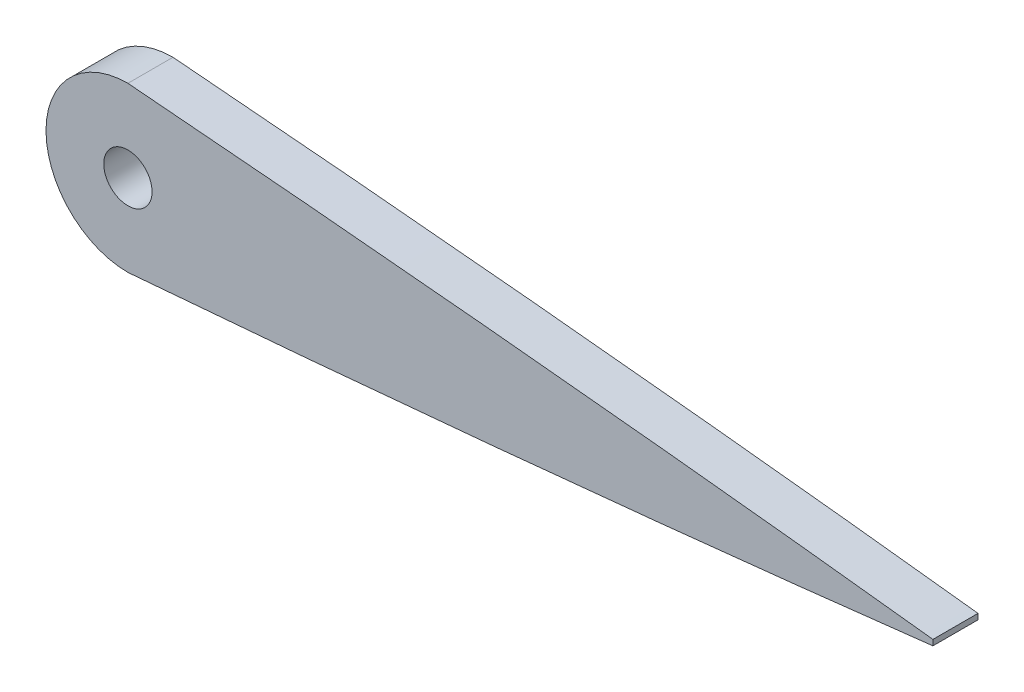
ISO-10303-21;
HEADER;
FILE_DESCRIPTION(('STEP AP214'),'2;1');
FILE_NAME('part.step','',(''),(''),'','','');
FILE_SCHEMA(('AUTOMOTIVE_DESIGN { 1 0 10303 214 1 1 1 1 }'));
ENDSEC;
DATA;
#1=APPLICATION_CONTEXT('core data for automotive mechanical design processes');
#2=APPLICATION_PROTOCOL_DEFINITION('international standard','automotive_design',2000,#1);
#3=PRODUCT_CONTEXT('',#1,'mechanical');
#4=PRODUCT('Part','Part','',(#3));
#5=PRODUCT_RELATED_PRODUCT_CATEGORY('part','',(#4));
#6=PRODUCT_DEFINITION_FORMATION('','',#4);
#7=PRODUCT_DEFINITION_CONTEXT('part definition',#1,'design');
#8=PRODUCT_DEFINITION('design','',#6,#7);
#9=PRODUCT_DEFINITION_SHAPE('','',#8);
#10=(LENGTH_UNIT() NAMED_UNIT(*) SI_UNIT(.MILLI.,.METRE.));
#11=(NAMED_UNIT(*) PLANE_ANGLE_UNIT() SI_UNIT($,.RADIAN.));
#12=(NAMED_UNIT(*) SI_UNIT($,.STERADIAN.) SOLID_ANGLE_UNIT());
#13=UNCERTAINTY_MEASURE_WITH_UNIT(LENGTH_MEASURE(1.E-05),#10,'distance_accuracy_value','');
#14=(GEOMETRIC_REPRESENTATION_CONTEXT(3) GLOBAL_UNCERTAINTY_ASSIGNED_CONTEXT((#13)) GLOBAL_UNIT_ASSIGNED_CONTEXT((#10,
#11,#12)) REPRESENTATION_CONTEXT('',''));
#15=CARTESIAN_POINT('',(0.,0.,0.));
#16=DIRECTION('',(0.,0.,1.));
#17=DIRECTION('',(1.,0.,0.));
#18=AXIS2_PLACEMENT_3D('',#15,#16,#17);
#19=CARTESIAN_POINT('',(150.000001319017,0.,1.4));
#20=DIRECTION('',(0.,0.,-1.));
#21=DIRECTION('',(-1.,0.,0.));
#22=AXIS2_PLACEMENT_3D('',#19,#20,#21);
#23=CYLINDRICAL_SURFACE('',#22,5.08710089871163);
#24=CARTESIAN_POINT('',(150.000001319017,0.,-1.4));
#25=DIRECTION('',(0.,0.,1.));
#26=DIRECTION('',(1.,0.,0.));
#27=AXIS2_PLACEMENT_3D('',#24,#25,#26);
#28=CIRCLE('',#27,5.08710089871163);
#29=CARTESIAN_POINT('',(150.,5.08710089871146,-1.4));
#30=VERTEX_POINT('',#29);
#31=CARTESIAN_POINT('',(150.,-5.08710089871146,-1.4));
#32=VERTEX_POINT('',#31);
#33=EDGE_CURVE('E136',#30,#32,#28,.T.);
#34=ORIENTED_EDGE('',*,*,#33,.T.);
#35=DIRECTION('',(0.,0.,-1.));
#36=VECTOR('',#35,1.);
#37=CARTESIAN_POINT('',(150.,-5.08710089871146,1.4));
#38=LINE('',#37,#36);
#39=CARTESIAN_POINT('',(150.,-5.08710089871146,1.4));
#40=VERTEX_POINT('',#39);
#41=EDGE_CURVE('E11',#40,#32,#38,.T.);
#42=ORIENTED_EDGE('',*,*,#41,.F.);
#43=CARTESIAN_POINT('',(150.000001319017,0.,1.4));
#44=DIRECTION('',(0.,0.,1.));
#45=DIRECTION('',(1.,0.,0.));
#46=AXIS2_PLACEMENT_3D('',#43,#44,#45);
#47=CIRCLE('',#46,5.08710089871163);
#48=CARTESIAN_POINT('',(150.,5.08710089871146,1.4));
#49=VERTEX_POINT('',#48);
#50=EDGE_CURVE('E90',#49,#40,#47,.T.);
#51=ORIENTED_EDGE('',*,*,#50,.F.);
#52=DIRECTION('',(0.,0.,-1.));
#53=VECTOR('',#52,1.);
#54=CARTESIAN_POINT('',(150.,5.08710089871146,1.4));
#55=LINE('',#54,#53);
#56=EDGE_CURVE('E105',#49,#30,#55,.T.);
#57=ORIENTED_EDGE('',*,*,#56,.T.);
#58=EDGE_LOOP('',(#34,#42,#51,#57));
#59=FACE_BOUND('',#58,.T.);
#60=ADVANCED_FACE('F41',(#59),#23,.T.);
#61=CARTESIAN_POINT('',(33.6,0.,1.4));
#62=CARTESIAN_POINT('',(33.6269941674373,-0.231708515527983,1.4));
#63=CARTESIAN_POINT('',(33.6837268204217,-0.71868181579728,1.4));
#64=CARTESIAN_POINT('',(34.1189953762262,-1.39684945733152,1.4));
#65=CARTESIAN_POINT('',(34.7710021592154,-2.03453876927053,1.4));
#66=CARTESIAN_POINT('',(35.6651570451169,-2.64410225227602,1.4));
#67=CARTESIAN_POINT('',(36.7878210833191,-3.22944151280152,1.4));
#68=CARTESIAN_POINT('',(38.1397245257122,-3.79104271473269,1.4));
#69=CARTESIAN_POINT('',(39.7153622867981,-4.3277629002946,1.4));
#70=CARTESIAN_POINT('',(41.5101784639862,-4.8379015027305,1.4));
#71=CARTESIAN_POINT('',(43.5185258591893,-5.31970764728648,1.4));
#72=CARTESIAN_POINT('',(45.7346309012544,-5.77126154267694,1.4));
#73=CARTESIAN_POINT('',(48.1524100311102,-6.19073197222748,1.4));
#74=CARTESIAN_POINT('',(50.7655901479076,-6.57637303978282,1.4));
#75=CARTESIAN_POINT('',(53.5677275795446,-6.92657061910981,1.4));
#76=CARTESIAN_POINT('',(56.5522008575467,-7.23984921539396,1.4));
#77=CARTESIAN_POINT('',(59.7122117540152,-7.51501997525792,1.4));
#78=CARTESIAN_POINT('',(63.0408031036648,-7.75098927114006,1.4));
#79=CARTESIAN_POINT('',(66.5308206591967,-7.94704431423214,1.4));
#80=CARTESIAN_POINT('',(70.1749391772892,-8.10268745028156,1.4));
#81=CARTESIAN_POINT('',(73.9656231927854,-8.21771888836872,1.4));
#82=CARTESIAN_POINT('',(77.8951316198913,-8.29213172726254,1.4));
#83=CARTESIAN_POINT('',(81.9554909551757,-8.32638483385091,1.4));
#84=CARTESIAN_POINT('',(86.1384972727807,-8.32098146620866,1.4));
#85=CARTESIAN_POINT('',(90.4356778928133,-8.27688640845994,1.4));
#86=CARTESIAN_POINT('',(94.8382835601136,-8.19518684837898,1.4));
#87=CARTESIAN_POINT('',(99.3372533058883,-8.07721034364158,1.4));
#88=CARTESIAN_POINT('',(103.923211277285,-7.92451466510414,1.4));
#89=CARTESIAN_POINT('',(108.586398201898,-7.73879249394249,1.4));
#90=CARTESIAN_POINT('',(113.316671903632,-7.5218716385051,1.4));
#91=CARTESIAN_POINT('',(118.103435227251,-7.27569840059715,1.4));
#92=CARTESIAN_POINT('',(122.935626986936,-7.00233408107662,1.4));
#93=CARTESIAN_POINT('',(127.801626971568,-6.70383804581322,1.4));
#94=CARTESIAN_POINT('',(132.689220420298,-6.38239371078741,1.4));
#95=CARTESIAN_POINT('',(137.585492164653,-6.04018744674526,1.4));
#96=CARTESIAN_POINT('',(142.476750858107,-5.67937341836179,1.4));
#97=CARTESIAN_POINT('',(147.348408074387,-5.30224620375692,1.4));
#98=CARTESIAN_POINT('',(152.184839901118,-4.91110131824046,1.4));
#99=CARTESIAN_POINT('',(156.969182150947,-4.50827690949581,1.4));
#100=CARTESIAN_POINT('',(161.68314962687,-4.09629096759658,1.4));
#101=CARTESIAN_POINT('',(166.30668258492,-3.67780398045322,1.4));
#102=CARTESIAN_POINT('',(170.817585440789,-3.25579759485396,1.4));
#103=CARTESIAN_POINT('',(175.190940480879,-2.83354037712416,1.4));
#104=CARTESIAN_POINT('',(179.398353356594,-2.41494180210841,1.4));
#105=CARTESIAN_POINT('',(183.406732335512,-2.00449023066667,1.4));
#106=CARTESIAN_POINT('',(187.176422044898,-1.60782267291746,1.4));
#107=CARTESIAN_POINT('',(190.657944971499,-1.23193839552261,1.4));
#108=CARTESIAN_POINT('',(193.785612886082,-0.886133118139137,1.4));
#109=CARTESIAN_POINT('',(196.461970705466,-0.583806064397546,1.4));
#110=CARTESIAN_POINT('',(198.485364747044,-0.351356883647495,1.4));
#111=CARTESIAN_POINT('',(199.600682764795,-0.221288407724341,1.4));
#112=CARTESIAN_POINT('',(200.,-0.17472,1.4));
#113=B_SPLINE_CURVE_WITH_KNOTS('',3,(#61,#62,#63,#64,#65,#66,#67,#68,#69,#70,#71,#72,#73,#74,
#75,#76,#77,#78,#79,#80,#81,#82,#83,#84,#85,#86,#87,#88,#89,#90,#91,#92,#93,#94,#95,#96,#97,#98,
#99,#100,#101,#102,#103,#104,#105,#106,#107,#108,#109,#110,#111,#112),.UNSPECIFIED.,.F.,.F.,(4,
1,1,1,1,1,1,1,1,1,1,1,1,1,1,1,1,1,1,1,1,1,1,1,1,1,1,1,1,1,1,1,1,1,1,1,1,1,1,1,1,1,1,1,1,1,1,1,1,
4),(0.,0.00409901119627092,0.00861474169622299,0.0139348547249599,0.0202777746115652,
0.0277529807018321,0.0364102145151941,0.0462664329749787,0.0573202378372115,0.0695589461393584,
0.0829628608595733,0.0975072182865601,0.113164081930901,0.129902689855962,0.147690303906225,
0.166492184642377,0.186271967143037,0.20699186142487,0.228612214931191,0.251092164926075,
0.274388983443392,0.298458209116106,0.323253842050904,0.348727970896185,0.374830386774742,
0.40150919043188,0.428710015435301,0.456376153357357,0.484448082626422,0.512863886494765,
0.541558094079265,0.570462312972837,0.599504247337292,0.628607348866529,0.657690446286488,
0.686667237400073,0.715444849047863,0.743923546243729,0.771994829693491,0.79954025298555,
0.826428322167508,0.852512114464386,0.877624445997854,0.901571133904931,0.924121062375889,
0.944988816472436,0.963803939012756,0.980044339265493,0.992855276123615,1.),.UNSPECIFIED.);
#114=DIRECTION('',(0.,0.,-1.));
#115=VECTOR('',#114,1.);
#116=SURFACE_OF_LINEAR_EXTRUSION('',#113,#115);
#117=CARTESIAN_POINT('',(33.6,0.,-1.4));
#118=CARTESIAN_POINT('',(33.6269941674373,-0.231708515527983,-1.4));
#119=CARTESIAN_POINT('',(33.6837268204217,-0.71868181579728,-1.4));
#120=CARTESIAN_POINT('',(34.1189953762262,-1.39684945733152,-1.4));
#121=CARTESIAN_POINT('',(34.7710021592154,-2.03453876927053,-1.4));
#122=CARTESIAN_POINT('',(35.6651570451169,-2.64410225227602,-1.4));
#123=CARTESIAN_POINT('',(36.7878210833191,-3.22944151280152,-1.4));
#124=CARTESIAN_POINT('',(38.1397245257122,-3.79104271473269,-1.4));
#125=CARTESIAN_POINT('',(39.7153622867981,-4.3277629002946,-1.4));
#126=CARTESIAN_POINT('',(41.5101784639862,-4.8379015027305,-1.4));
#127=CARTESIAN_POINT('',(43.5185258591893,-5.31970764728648,-1.4));
#128=CARTESIAN_POINT('',(45.7346309012544,-5.77126154267694,-1.4));
#129=CARTESIAN_POINT('',(48.1524100311102,-6.19073197222748,-1.4));
#130=CARTESIAN_POINT('',(50.7655901479076,-6.57637303978282,-1.4));
#131=CARTESIAN_POINT('',(53.5677275795446,-6.92657061910981,-1.4));
#132=CARTESIAN_POINT('',(56.5522008575467,-7.23984921539396,-1.4));
#133=CARTESIAN_POINT('',(59.7122117540152,-7.51501997525792,-1.4));
#134=CARTESIAN_POINT('',(63.0408031036648,-7.75098927114006,-1.4));
#135=CARTESIAN_POINT('',(66.5308206591967,-7.94704431423214,-1.4));
#136=CARTESIAN_POINT('',(70.1749391772892,-8.10268745028156,-1.4));
#137=CARTESIAN_POINT('',(73.9656231927854,-8.21771888836872,-1.4));
#138=CARTESIAN_POINT('',(77.8951316198913,-8.29213172726254,-1.4));
#139=CARTESIAN_POINT('',(81.9554909551757,-8.32638483385091,-1.4));
#140=CARTESIAN_POINT('',(86.1384972727807,-8.32098146620866,-1.4));
#141=CARTESIAN_POINT('',(90.4356778928133,-8.27688640845994,-1.4));
#142=CARTESIAN_POINT('',(94.8382835601136,-8.19518684837898,-1.4));
#143=CARTESIAN_POINT('',(99.3372533058883,-8.07721034364158,-1.4));
#144=CARTESIAN_POINT('',(103.923211277285,-7.92451466510414,-1.4));
#145=CARTESIAN_POINT('',(108.586398201898,-7.73879249394249,-1.4));
#146=CARTESIAN_POINT('',(113.316671903632,-7.5218716385051,-1.4));
#147=CARTESIAN_POINT('',(118.103435227251,-7.27569840059715,-1.4));
#148=CARTESIAN_POINT('',(122.935626986936,-7.00233408107662,-1.4));
#149=CARTESIAN_POINT('',(127.801626971568,-6.70383804581322,-1.4));
#150=CARTESIAN_POINT('',(132.689220420298,-6.38239371078741,-1.4));
#151=CARTESIAN_POINT('',(137.585492164653,-6.04018744674526,-1.4));
#152=CARTESIAN_POINT('',(142.476750858107,-5.67937341836179,-1.4));
#153=CARTESIAN_POINT('',(147.348408074387,-5.30224620375692,-1.4));
#154=CARTESIAN_POINT('',(152.184839901118,-4.91110131824046,-1.4));
#155=CARTESIAN_POINT('',(156.969182150947,-4.50827690949581,-1.4));
#156=CARTESIAN_POINT('',(161.68314962687,-4.09629096759658,-1.4));
#157=CARTESIAN_POINT('',(166.30668258492,-3.67780398045322,-1.4));
#158=CARTESIAN_POINT('',(170.817585440789,-3.25579759485396,-1.4));
#159=CARTESIAN_POINT('',(175.190940480879,-2.83354037712416,-1.4));
#160=CARTESIAN_POINT('',(179.398353356594,-2.41494180210841,-1.4));
#161=CARTESIAN_POINT('',(183.406732335512,-2.00449023066667,-1.4));
#162=CARTESIAN_POINT('',(187.176422044898,-1.60782267291746,-1.4));
#163=CARTESIAN_POINT('',(190.657944971499,-1.23193839552261,-1.4));
#164=CARTESIAN_POINT('',(193.785612886082,-0.886133118139137,-1.4));
#165=CARTESIAN_POINT('',(196.461970705466,-0.583806064397546,-1.4));
#166=CARTESIAN_POINT('',(198.485364747044,-0.351356883647495,-1.4));
#167=CARTESIAN_POINT('',(199.600682764795,-0.221288407724341,-1.4));
#168=CARTESIAN_POINT('',(200.,-0.17472,-1.4));
#169=B_SPLINE_CURVE_WITH_KNOTS('',3,(#117,#118,#119,#120,#121,#122,#123,#124,#125,#126,#127,
#128,#129,#130,#131,#132,#133,#134,#135,#136,#137,#138,#139,#140,#141,#142,#143,#144,#145,#146,
#147,#148,#149,#150,#151,#152,#153,#154,#155,#156,#157,#158,#159,#160,#161,#162,#163,#164,#165,
#166,#167,#168),.UNSPECIFIED.,.F.,.F.,(4,1,1,1,1,1,1,1,1,1,1,1,1,1,1,1,1,1,1,1,1,1,1,1,1,1,1,1,
1,1,1,1,1,1,1,1,1,1,1,1,1,1,1,1,1,1,1,1,1,4),(0.,0.00409901119627092,0.00861474169622299,
0.0139348547249599,0.0202777746115652,0.0277529807018321,0.0364102145151941,0.0462664329749787,
0.0573202378372115,0.0695589461393584,0.0829628608595733,0.0975072182865601,0.113164081930901,
0.129902689855962,0.147690303906225,0.166492184642377,0.186271967143037,0.20699186142487,
0.228612214931191,0.251092164926075,0.274388983443392,0.298458209116106,0.323253842050904,
0.348727970896185,0.374830386774742,0.40150919043188,0.428710015435301,0.456376153357357,
0.484448082626422,0.512863886494765,0.541558094079265,0.570462312972837,0.599504247337292,
0.628607348866529,0.657690446286488,0.686667237400073,0.715444849047863,0.743923546243729,
0.771994829693491,0.79954025298555,0.826428322167508,0.852512114464386,0.877624445997854,
0.901571133904931,0.924121062375889,0.944988816472436,0.963803939012756,0.980044339265493,
0.992855276123615,1.),.UNSPECIFIED.);
#170=CARTESIAN_POINT('',(200.,-0.17472,-1.4));
#171=VERTEX_POINT('',#170);
#172=EDGE_CURVE('E96',#32,#171,#169,.T.);
#173=ORIENTED_EDGE('',*,*,#172,.T.);
#174=DIRECTION('',(0.,0.,-1.));
#175=VECTOR('',#174,1.);
#176=CARTESIAN_POINT('',(200.,-0.17472,1.4));
#177=LINE('',#176,#175);
#178=CARTESIAN_POINT('',(200.,-0.17472,1.4));
#179=VERTEX_POINT('',#178);
#180=EDGE_CURVE('E51',#179,#171,#177,.T.);
#181=ORIENTED_EDGE('',*,*,#180,.F.);
#182=EDGE_CURVE('E85',#40,#179,#113,.T.);
#183=ORIENTED_EDGE('',*,*,#182,.F.);
#184=ORIENTED_EDGE('',*,*,#41,.T.);
#185=EDGE_LOOP('',(#173,#181,#183,#184));
#186=FACE_BOUND('',#185,.T.);
#187=ADVANCED_FACE('F95',(#186),#116,.F.);
#188=CARTESIAN_POINT('',(200.,0.,1.4));
#189=DIRECTION('',(1.,0.,0.));
#190=DIRECTION('',(0.,0.,-1.));
#191=AXIS2_PLACEMENT_3D('',#188,#189,#190);
#192=PLANE('',#191);
#193=DIRECTION('',(0.,-1.,0.));
#194=VECTOR('',#193,1.);
#195=CARTESIAN_POINT('',(200.,0.,-1.4));
#196=LINE('',#195,#194);
#197=CARTESIAN_POINT('',(200.,0.17472,-1.4));
#198=VERTEX_POINT('',#197);
#199=EDGE_CURVE('E141',#198,#171,#196,.T.);
#200=ORIENTED_EDGE('',*,*,#199,.F.);
#201=DIRECTION('',(0.,0.,-1.));
#202=VECTOR('',#201,1.);
#203=CARTESIAN_POINT('',(200.,0.17472,1.4));
#204=LINE('',#203,#202);
#205=CARTESIAN_POINT('',(200.,0.17472,1.4));
#206=VERTEX_POINT('',#205);
#207=EDGE_CURVE('E75',#206,#198,#204,.T.);
#208=ORIENTED_EDGE('',*,*,#207,.F.);
#209=DIRECTION('',(0.,-1.,0.));
#210=VECTOR('',#209,1.);
#211=CARTESIAN_POINT('',(200.,0.,1.4));
#212=LINE('',#211,#210);
#213=EDGE_CURVE('E88',#206,#179,#212,.T.);
#214=ORIENTED_EDGE('',*,*,#213,.T.);
#215=ORIENTED_EDGE('',*,*,#180,.T.);
#216=EDGE_LOOP('',(#200,#208,#214,#215));
#217=FACE_BOUND('',#216,.T.);
#218=ADVANCED_FACE('F101',(#217),#192,.T.);
#219=CARTESIAN_POINT('',(150.000001319017,0.,1.4));
#220=DIRECTION('',(0.,0.,-1.));
#221=DIRECTION('',(-1.,0.,0.));
#222=AXIS2_PLACEMENT_3D('',#219,#220,#221);
#223=CYLINDRICAL_SURFACE('',#222,1.5);
#224=CARTESIAN_POINT('',(150.000001319017,0.,1.4));
#225=DIRECTION('',(0.,0.,1.));
#226=DIRECTION('',(1.,0.,0.));
#227=AXIS2_PLACEMENT_3D('',#224,#225,#226);
#228=CIRCLE('',#227,1.5);
#229=CARTESIAN_POINT('',(151.500001319017,0.,1.4));
#230=VERTEX_POINT('',#229);
#231=EDGE_CURVE('E156',#230,#230,#228,.T.);
#232=ORIENTED_EDGE('',*,*,#231,.T.);
#233=EDGE_LOOP('',(#232));
#234=FACE_BOUND('',#233,.T.);
#235=CARTESIAN_POINT('',(150.000001319017,0.,-1.4));
#236=DIRECTION('',(0.,0.,1.));
#237=DIRECTION('',(1.,0.,0.));
#238=AXIS2_PLACEMENT_3D('',#235,#236,#237);
#239=CIRCLE('',#238,1.5);
#240=CARTESIAN_POINT('',(151.500001319017,0.,-1.4));
#241=VERTEX_POINT('',#240);
#242=EDGE_CURVE('E115',#241,#241,#239,.T.);
#243=ORIENTED_EDGE('',*,*,#242,.F.);
#244=EDGE_LOOP('',(#243));
#245=FACE_BOUND('',#244,.T.);
#246=ADVANCED_FACE('F43',(#234,#245),#223,.F.);
#247=CARTESIAN_POINT('',(200.,0.17472,1.4));
#248=CARTESIAN_POINT('',(199.600682764795,0.221288407724341,1.4));
#249=CARTESIAN_POINT('',(198.485364747044,0.351356883647497,1.4));
#250=CARTESIAN_POINT('',(196.461970705466,0.583806064397545,1.4));
#251=CARTESIAN_POINT('',(193.785612886082,0.886133118139137,1.4));
#252=CARTESIAN_POINT('',(190.657944971499,1.23193839552261,1.4));
#253=CARTESIAN_POINT('',(187.176422044898,1.60782267291746,1.4));
#254=CARTESIAN_POINT('',(183.406732335512,2.00449023066667,1.4));
#255=CARTESIAN_POINT('',(179.398353356594,2.41494180210841,1.4));
#256=CARTESIAN_POINT('',(175.190940480879,2.83354037712416,1.4));
#257=CARTESIAN_POINT('',(170.817585440789,3.25579759485396,1.4));
#258=CARTESIAN_POINT('',(166.30668258492,3.67780398045322,1.4));
#259=CARTESIAN_POINT('',(161.68314962687,4.09629096759659,1.4));
#260=CARTESIAN_POINT('',(156.969182150947,4.50827690949581,1.4));
#261=CARTESIAN_POINT('',(152.184839901118,4.91110131824046,1.4));
#262=CARTESIAN_POINT('',(147.348408074387,5.30224620375692,1.4));
#263=CARTESIAN_POINT('',(142.476750858107,5.67937341836179,1.4));
#264=CARTESIAN_POINT('',(137.585492164653,6.04018744674526,1.4));
#265=CARTESIAN_POINT('',(132.689220420298,6.38239371078741,1.4));
#266=CARTESIAN_POINT('',(127.801626971568,6.70383804581322,1.4));
#267=CARTESIAN_POINT('',(122.935626986936,7.00233408107662,1.4));
#268=CARTESIAN_POINT('',(118.103435227251,7.27569840059715,1.4));
#269=CARTESIAN_POINT('',(113.316671903632,7.5218716385051,1.4));
#270=CARTESIAN_POINT('',(108.586398201898,7.73879249394249,1.4));
#271=CARTESIAN_POINT('',(103.923211277285,7.92451466510414,1.4));
#272=CARTESIAN_POINT('',(99.3372533058883,8.07721034364158,1.4));
#273=CARTESIAN_POINT('',(94.8382835601136,8.19518684837899,1.4));
#274=CARTESIAN_POINT('',(90.4356778928133,8.27688640845993,1.4));
#275=CARTESIAN_POINT('',(86.1384972727807,8.32098146620866,1.4));
#276=CARTESIAN_POINT('',(81.9554909551757,8.3263848338509,1.4));
#277=CARTESIAN_POINT('',(77.8951316198913,8.29213172726254,1.4));
#278=CARTESIAN_POINT('',(73.9656231927854,8.21771888836873,1.4));
#279=CARTESIAN_POINT('',(70.1749391772892,8.10268745028156,1.4));
#280=CARTESIAN_POINT('',(66.5308206591967,7.94704431423214,1.4));
#281=CARTESIAN_POINT('',(63.0408031036648,7.75098927114006,1.4));
#282=CARTESIAN_POINT('',(59.7122117540152,7.51501997525792,1.4));
#283=CARTESIAN_POINT('',(56.5522008575467,7.23984921539396,1.4));
#284=CARTESIAN_POINT('',(53.5677275795446,6.92657061910981,1.4));
#285=CARTESIAN_POINT('',(50.7655901479076,6.57637303978282,1.4));
#286=CARTESIAN_POINT('',(48.1524100311102,6.19073197222748,1.4));
#287=CARTESIAN_POINT('',(45.7346309012544,5.77126154267694,1.4));
#288=CARTESIAN_POINT('',(43.5185258591893,5.31970764728648,1.4));
#289=CARTESIAN_POINT('',(41.5101784639862,4.8379015027305,1.4));
#290=CARTESIAN_POINT('',(39.7153622867981,4.32776290029461,1.4));
#291=CARTESIAN_POINT('',(38.1397245257121,3.79104271473268,1.4));
#292=CARTESIAN_POINT('',(36.7878210833191,3.22944151280153,1.4));
#293=CARTESIAN_POINT('',(35.6651570451169,2.64410225227602,1.4));
#294=CARTESIAN_POINT('',(34.7710021592154,2.03453876927052,1.4));
#295=CARTESIAN_POINT('',(34.1189953762262,1.39684945733151,1.4));
#296=CARTESIAN_POINT('',(33.6837268204217,0.718681815797279,1.4));
#297=CARTESIAN_POINT('',(33.6269941674373,0.231708515527983,1.4));
#298=CARTESIAN_POINT('',(33.6,0.,1.4));
#299=B_SPLINE_CURVE_WITH_KNOTS('',3,(#247,#248,#249,#250,#251,#252,#253,#254,#255,#256,#257,
#258,#259,#260,#261,#262,#263,#264,#265,#266,#267,#268,#269,#270,#271,#272,#273,#274,#275,#276,
#277,#278,#279,#280,#281,#282,#283,#284,#285,#286,#287,#288,#289,#290,#291,#292,#293,#294,#295,
#296,#297,#298),.UNSPECIFIED.,.F.,.F.,(4,1,1,1,1,1,1,1,1,1,1,1,1,1,1,1,1,1,1,1,1,1,1,1,1,1,1,1,
1,1,1,1,1,1,1,1,1,1,1,1,1,1,1,1,1,1,1,1,1,4),(0.,0.0071447238763848,0.019955660734507,
0.0361960609872442,0.0550111835275645,0.0758789376241111,0.0984288660950692,0.122375554002146,
0.147487885535614,0.173571677832492,0.20045974701445,0.228005170306509,0.256076453756271,
0.284555150952137,0.313332762599927,0.342309553713512,0.371392651133471,0.400495752662708,
0.429537687027163,0.458441905920735,0.487136113505235,0.515551917373578,0.543623846642643,
0.571289984564699,0.59849080956812,0.625169613225258,0.651272029103815,0.676746157949096,
0.701541790883895,0.725611016556608,0.748907835073925,0.771387785068809,0.79300813857513,
0.813728032856963,0.833507815357623,0.852309696093775,0.870097310144038,0.886835918069099,
0.90249278171344,0.917037139140427,0.930441053860642,0.942679762162788,0.953733567025021,
0.963589785484806,0.972247019298168,0.979722225388435,0.98606514527504,0.991385258303777,
0.995900988803729,1.),.UNSPECIFIED.);
#300=DIRECTION('',(0.,0.,-1.));
#301=VECTOR('',#300,1.);
#302=SURFACE_OF_LINEAR_EXTRUSION('',#299,#301);
#303=CARTESIAN_POINT('',(200.,0.17472,-1.4));
#304=CARTESIAN_POINT('',(199.600682764795,0.221288407724341,-1.4));
#305=CARTESIAN_POINT('',(198.485364747044,0.351356883647497,-1.4));
#306=CARTESIAN_POINT('',(196.461970705466,0.583806064397545,-1.4));
#307=CARTESIAN_POINT('',(193.785612886082,0.886133118139137,-1.4));
#308=CARTESIAN_POINT('',(190.657944971499,1.23193839552261,-1.4));
#309=CARTESIAN_POINT('',(187.176422044898,1.60782267291746,-1.4));
#310=CARTESIAN_POINT('',(183.406732335512,2.00449023066667,-1.4));
#311=CARTESIAN_POINT('',(179.398353356594,2.41494180210841,-1.4));
#312=CARTESIAN_POINT('',(175.190940480879,2.83354037712416,-1.4));
#313=CARTESIAN_POINT('',(170.817585440789,3.25579759485396,-1.4));
#314=CARTESIAN_POINT('',(166.30668258492,3.67780398045322,-1.4));
#315=CARTESIAN_POINT('',(161.68314962687,4.09629096759659,-1.4));
#316=CARTESIAN_POINT('',(156.969182150947,4.50827690949581,-1.4));
#317=CARTESIAN_POINT('',(152.184839901118,4.91110131824046,-1.4));
#318=CARTESIAN_POINT('',(147.348408074387,5.30224620375692,-1.4));
#319=CARTESIAN_POINT('',(142.476750858107,5.67937341836179,-1.4));
#320=CARTESIAN_POINT('',(137.585492164653,6.04018744674526,-1.4));
#321=CARTESIAN_POINT('',(132.689220420298,6.38239371078741,-1.4));
#322=CARTESIAN_POINT('',(127.801626971568,6.70383804581322,-1.4));
#323=CARTESIAN_POINT('',(122.935626986936,7.00233408107662,-1.4));
#324=CARTESIAN_POINT('',(118.103435227251,7.27569840059715,-1.4));
#325=CARTESIAN_POINT('',(113.316671903632,7.5218716385051,-1.4));
#326=CARTESIAN_POINT('',(108.586398201898,7.73879249394249,-1.4));
#327=CARTESIAN_POINT('',(103.923211277285,7.92451466510414,-1.4));
#328=CARTESIAN_POINT('',(99.3372533058883,8.07721034364158,-1.4));
#329=CARTESIAN_POINT('',(94.8382835601136,8.19518684837899,-1.4));
#330=CARTESIAN_POINT('',(90.4356778928133,8.27688640845993,-1.4));
#331=CARTESIAN_POINT('',(86.1384972727807,8.32098146620866,-1.4));
#332=CARTESIAN_POINT('',(81.9554909551757,8.3263848338509,-1.4));
#333=CARTESIAN_POINT('',(77.8951316198913,8.29213172726254,-1.4));
#334=CARTESIAN_POINT('',(73.9656231927854,8.21771888836873,-1.4));
#335=CARTESIAN_POINT('',(70.1749391772892,8.10268745028156,-1.4));
#336=CARTESIAN_POINT('',(66.5308206591967,7.94704431423214,-1.4));
#337=CARTESIAN_POINT('',(63.0408031036648,7.75098927114006,-1.4));
#338=CARTESIAN_POINT('',(59.7122117540152,7.51501997525792,-1.4));
#339=CARTESIAN_POINT('',(56.5522008575467,7.23984921539396,-1.4));
#340=CARTESIAN_POINT('',(53.5677275795446,6.92657061910981,-1.4));
#341=CARTESIAN_POINT('',(50.7655901479076,6.57637303978282,-1.4));
#342=CARTESIAN_POINT('',(48.1524100311102,6.19073197222748,-1.4));
#343=CARTESIAN_POINT('',(45.7346309012544,5.77126154267694,-1.4));
#344=CARTESIAN_POINT('',(43.5185258591893,5.31970764728648,-1.4));
#345=CARTESIAN_POINT('',(41.5101784639862,4.8379015027305,-1.4));
#346=CARTESIAN_POINT('',(39.7153622867981,4.32776290029461,-1.4));
#347=CARTESIAN_POINT('',(38.1397245257121,3.79104271473268,-1.4));
#348=CARTESIAN_POINT('',(36.7878210833191,3.22944151280153,-1.4));
#349=CARTESIAN_POINT('',(35.6651570451169,2.64410225227602,-1.4));
#350=CARTESIAN_POINT('',(34.7710021592154,2.03453876927052,-1.4));
#351=CARTESIAN_POINT('',(34.1189953762262,1.39684945733151,-1.4));
#352=CARTESIAN_POINT('',(33.6837268204217,0.718681815797279,-1.4));
#353=CARTESIAN_POINT('',(33.6269941674373,0.231708515527983,-1.4));
#354=CARTESIAN_POINT('',(33.6,0.,-1.4));
#355=B_SPLINE_CURVE_WITH_KNOTS('',3,(#303,#304,#305,#306,#307,#308,#309,#310,#311,#312,#313,
#314,#315,#316,#317,#318,#319,#320,#321,#322,#323,#324,#325,#326,#327,#328,#329,#330,#331,#332,
#333,#334,#335,#336,#337,#338,#339,#340,#341,#342,#343,#344,#345,#346,#347,#348,#349,#350,#351,
#352,#353,#354),.UNSPECIFIED.,.F.,.F.,(4,1,1,1,1,1,1,1,1,1,1,1,1,1,1,1,1,1,1,1,1,1,1,1,1,1,1,1,
1,1,1,1,1,1,1,1,1,1,1,1,1,1,1,1,1,1,1,1,1,4),(0.,0.0071447238763848,0.019955660734507,
0.0361960609872442,0.0550111835275645,0.0758789376241111,0.0984288660950692,0.122375554002146,
0.147487885535614,0.173571677832492,0.20045974701445,0.228005170306509,0.256076453756271,
0.284555150952137,0.313332762599927,0.342309553713512,0.371392651133471,0.400495752662708,
0.429537687027163,0.458441905920735,0.487136113505235,0.515551917373578,0.543623846642643,
0.571289984564699,0.59849080956812,0.625169613225258,0.651272029103815,0.676746157949096,
0.701541790883895,0.725611016556608,0.748907835073925,0.771387785068809,0.79300813857513,
0.813728032856963,0.833507815357623,0.852309696093775,0.870097310144038,0.886835918069099,
0.90249278171344,0.917037139140427,0.930441053860642,0.942679762162788,0.953733567025021,
0.963589785484806,0.972247019298168,0.979722225388435,0.98606514527504,0.991385258303777,
0.995900988803729,1.),.UNSPECIFIED.);
#356=EDGE_CURVE('E78',#198,#30,#355,.T.);
#357=ORIENTED_EDGE('',*,*,#356,.T.);
#358=ORIENTED_EDGE('',*,*,#56,.F.);
#359=EDGE_CURVE('E59',#206,#49,#299,.T.);
#360=ORIENTED_EDGE('',*,*,#359,.F.);
#361=ORIENTED_EDGE('',*,*,#207,.T.);
#362=EDGE_LOOP('',(#357,#358,#360,#361));
#363=FACE_BOUND('',#362,.T.);
#364=ADVANCED_FACE('F121',(#363),#302,.F.);
#365=CARTESIAN_POINT('',(0.,0.,1.4));
#366=DIRECTION('',(0.,0.,1.));
#367=DIRECTION('',(1.,0.,0.));
#368=AXIS2_PLACEMENT_3D('',#365,#366,#367);
#369=PLANE('',#368);
#370=ORIENTED_EDGE('',*,*,#231,.F.);
#371=EDGE_LOOP('',(#370));
#372=FACE_BOUND('',#371,.T.);
#373=ORIENTED_EDGE('',*,*,#50,.T.);
#374=ORIENTED_EDGE('',*,*,#182,.T.);
#375=ORIENTED_EDGE('',*,*,#213,.F.);
#376=ORIENTED_EDGE('',*,*,#359,.T.);
#377=EDGE_LOOP('',(#373,#374,#375,#376));
#378=FACE_BOUND('',#377,.T.);
#379=ADVANCED_FACE('F86',(#372,#378),#369,.T.);
#380=CARTESIAN_POINT('',(0.,0.,-1.4));
#381=DIRECTION('',(0.,0.,1.));
#382=DIRECTION('',(1.,0.,0.));
#383=AXIS2_PLACEMENT_3D('',#380,#381,#382);
#384=PLANE('',#383);
#385=ORIENTED_EDGE('',*,*,#242,.T.);
#386=EDGE_LOOP('',(#385));
#387=FACE_BOUND('',#386,.T.);
#388=ORIENTED_EDGE('',*,*,#33,.F.);
#389=ORIENTED_EDGE('',*,*,#356,.F.);
#390=ORIENTED_EDGE('',*,*,#199,.T.);
#391=ORIENTED_EDGE('',*,*,#172,.F.);
#392=EDGE_LOOP('',(#388,#389,#390,#391));
#393=FACE_BOUND('',#392,.T.);
#394=ADVANCED_FACE('F125',(#387,#393),#384,.F.);
#395=CLOSED_SHELL('',(#60,#187,#218,#246,#364,#379,#394));
#396=MANIFOLD_SOLID_BREP('B2',#395);
#397=ADVANCED_BREP_SHAPE_REPRESENTATION('',(#18,#396),#14);
#398=SHAPE_DEFINITION_REPRESENTATION(#9,#397);
ENDSEC;
END-ISO-10303-21;
